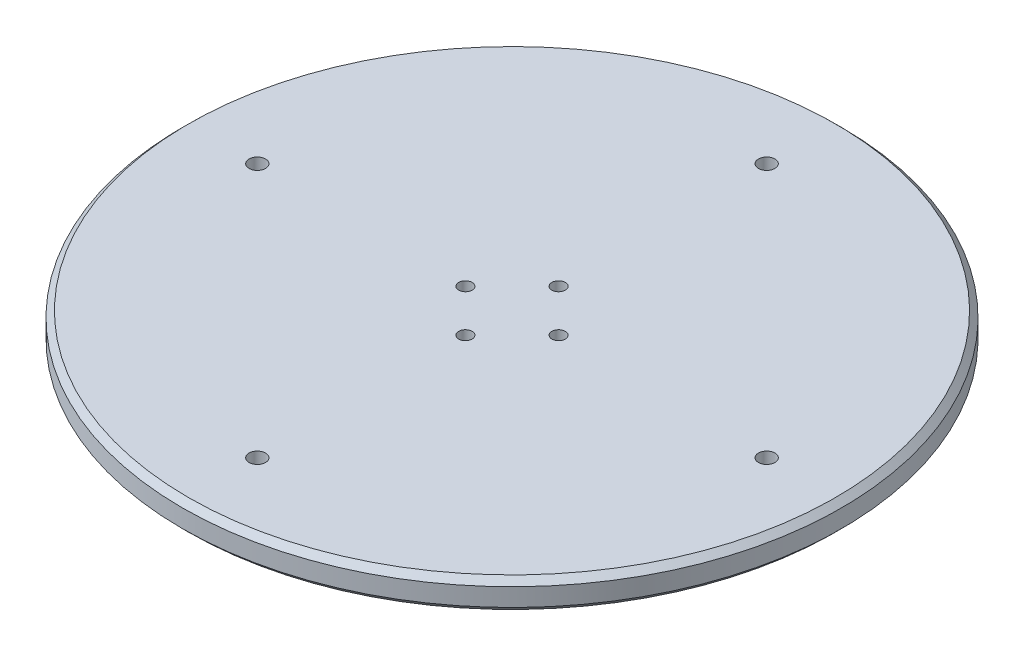
ISO-10303-21;
HEADER;
FILE_DESCRIPTION(('STEP AP214'),'2;1');
FILE_NAME('part.step','',(''),(''),'','','');
FILE_SCHEMA(('AUTOMOTIVE_DESIGN { 1 0 10303 214 1 1 1 1 }'));
ENDSEC;
DATA;
#1=APPLICATION_CONTEXT('core data for automotive mechanical design processes');
#2=APPLICATION_PROTOCOL_DEFINITION('international standard','automotive_design',2000,#1);
#3=PRODUCT_CONTEXT('',#1,'mechanical');
#4=PRODUCT('Part','Part','',(#3));
#5=PRODUCT_RELATED_PRODUCT_CATEGORY('part','',(#4));
#6=PRODUCT_DEFINITION_FORMATION('','',#4);
#7=PRODUCT_DEFINITION_CONTEXT('part definition',#1,'design');
#8=PRODUCT_DEFINITION('design','',#6,#7);
#9=PRODUCT_DEFINITION_SHAPE('','',#8);
#10=(LENGTH_UNIT() NAMED_UNIT(*) SI_UNIT(.MILLI.,.METRE.));
#11=(NAMED_UNIT(*) PLANE_ANGLE_UNIT() SI_UNIT($,.RADIAN.));
#12=(NAMED_UNIT(*) SI_UNIT($,.STERADIAN.) SOLID_ANGLE_UNIT());
#13=UNCERTAINTY_MEASURE_WITH_UNIT(LENGTH_MEASURE(1.E-05),#10,'distance_accuracy_value','');
#14=(GEOMETRIC_REPRESENTATION_CONTEXT(3) GLOBAL_UNCERTAINTY_ASSIGNED_CONTEXT((#13)) GLOBAL_UNIT_ASSIGNED_CONTEXT((#10,
#11,#12)) REPRESENTATION_CONTEXT('',''));
#15=CARTESIAN_POINT('',(0.,0.,0.));
#16=DIRECTION('',(0.,0.,1.));
#17=DIRECTION('',(1.,0.,0.));
#18=AXIS2_PLACEMENT_3D('',#15,#16,#17);
#19=CARTESIAN_POINT('',(0.,10.,0.));
#20=DIRECTION('',(0.,-1.,0.));
#21=DIRECTION('',(0.,0.,-1.));
#22=AXIS2_PLACEMENT_3D('',#19,#20,#21);
#23=CYLINDRICAL_SURFACE('',#22,110.);
#24=CARTESIAN_POINT('',(0.,2.00000000000003,0.));
#25=DIRECTION('',(0.,1.,0.));
#26=DIRECTION('',(0.,0.,1.));
#27=AXIS2_PLACEMENT_3D('',#24,#25,#26);
#28=CIRCLE('',#27,110.);
#29=CARTESIAN_POINT('',(0.,2.00000000000003,110.));
#30=VERTEX_POINT('',#29);
#31=EDGE_CURVE('E51',#30,#30,#28,.T.);
#32=ORIENTED_EDGE('',*,*,#31,.T.);
#33=EDGE_LOOP('',(#32));
#34=FACE_BOUND('',#33,.T.);
#35=CARTESIAN_POINT('',(0.,7.99999999999994,0.));
#36=DIRECTION('',(0.,1.,0.));
#37=DIRECTION('',(0.,0.,1.));
#38=AXIS2_PLACEMENT_3D('',#35,#36,#37);
#39=CIRCLE('',#38,110.);
#40=CARTESIAN_POINT('',(0.,7.99999999999994,110.));
#41=VERTEX_POINT('',#40);
#42=EDGE_CURVE('E55',#41,#41,#39,.F.);
#43=ORIENTED_EDGE('',*,*,#42,.T.);
#44=EDGE_LOOP('',(#43));
#45=FACE_BOUND('',#44,.T.);
#46=ADVANCED_FACE('F39',(#34,#45),#23,.T.);
#47=CARTESIAN_POINT('',(0.,10.,0.));
#48=DIRECTION('',(0.,1.,0.));
#49=DIRECTION('',(0.,0.,1.));
#50=AXIS2_PLACEMENT_3D('',#47,#48,#49);
#51=PLANE('',#50);
#52=CARTESIAN_POINT('',(14.8492424049175,10.,-0.707106781186474));
#53=DIRECTION('',(0.,1.,0.));
#54=DIRECTION('',(0.,0.,1.));
#55=AXIS2_PLACEMENT_3D('',#52,#53,#54);
#56=CIRCLE('',#55,2.25);
#57=CARTESIAN_POINT('',(14.8492424049175,10.,1.54289321881353));
#58=VERTEX_POINT('',#57);
#59=EDGE_CURVE('E103',#58,#58,#56,.T.);
#60=ORIENTED_EDGE('',*,*,#59,.F.);
#61=EDGE_LOOP('',(#60));
#62=FACE_BOUND('',#61,.T.);
#63=CARTESIAN_POINT('',(0.707106781186637,10.,-14.8492424049175));
#64=DIRECTION('',(0.,1.,0.));
#65=DIRECTION('',(0.,0.,-1.));
#66=AXIS2_PLACEMENT_3D('',#63,#64,#65);
#67=CIRCLE('',#66,2.25);
#68=CARTESIAN_POINT('',(0.707106781186637,10.,-17.0992424049175));
#69=VERTEX_POINT('',#68);
#70=EDGE_CURVE('E100',#69,#69,#67,.T.);
#71=ORIENTED_EDGE('',*,*,#70,.F.);
#72=EDGE_LOOP('',(#71));
#73=FACE_BOUND('',#72,.T.);
#74=CARTESIAN_POINT('',(-14.8492424049176,10.,0.707106781186647));
#75=DIRECTION('',(0.,1.,0.));
#76=DIRECTION('',(0.,0.,1.));
#77=AXIS2_PLACEMENT_3D('',#74,#75,#76);
#78=CIRCLE('',#77,2.25);
#79=CARTESIAN_POINT('',(-14.8492424049176,10.,2.95710678118665));
#80=VERTEX_POINT('',#79);
#81=EDGE_CURVE('E94',#80,#80,#78,.T.);
#82=ORIENTED_EDGE('',*,*,#81,.F.);
#83=EDGE_LOOP('',(#82));
#84=FACE_BOUND('',#83,.T.);
#85=CARTESIAN_POINT('',(-0.707106781186627,10.,14.8492424049176));
#86=DIRECTION('',(0.,1.,0.));
#87=DIRECTION('',(0.,0.,-1.));
#88=AXIS2_PLACEMENT_3D('',#85,#86,#87);
#89=CIRCLE('',#88,2.25);
#90=CARTESIAN_POINT('',(-0.707106781186627,10.,12.5992424049176));
#91=VERTEX_POINT('',#90);
#92=EDGE_CURVE('E88',#91,#91,#89,.T.);
#93=ORIENTED_EDGE('',*,*,#92,.F.);
#94=EDGE_LOOP('',(#93));
#95=FACE_BOUND('',#94,.T.);
#96=CARTESIAN_POINT('',(0.,10.,0.));
#97=DIRECTION('',(0.,1.,0.));
#98=DIRECTION('',(0.,0.,1.));
#99=AXIS2_PLACEMENT_3D('',#96,#97,#98);
#100=CIRCLE('',#99,108.);
#101=CARTESIAN_POINT('',(0.,10.,108.));
#102=VERTEX_POINT('',#101);
#103=EDGE_CURVE('E10',#102,#102,#100,.T.);
#104=ORIENTED_EDGE('',*,*,#103,.T.);
#105=EDGE_LOOP('',(#104));
#106=FACE_BOUND('',#105,.T.);
#107=CARTESIAN_POINT('',(-85.,10.,0.));
#108=DIRECTION('',(0.,1.,0.));
#109=DIRECTION('',(0.,0.,1.));
#110=AXIS2_PLACEMENT_3D('',#107,#108,#109);
#111=CIRCLE('',#110,2.75000000000001);
#112=CARTESIAN_POINT('',(-85.,10.,2.75000000000001));
#113=VERTEX_POINT('',#112);
#114=EDGE_CURVE('E80',#113,#113,#111,.T.);
#115=ORIENTED_EDGE('',*,*,#114,.F.);
#116=EDGE_LOOP('',(#115));
#117=FACE_BOUND('',#116,.T.);
#118=CARTESIAN_POINT('',(2.96775913801666E-13,10.,-85.));
#119=DIRECTION('',(0.,1.,0.));
#120=DIRECTION('',(0.,0.,1.));
#121=AXIS2_PLACEMENT_3D('',#118,#119,#120);
#122=CIRCLE('',#121,2.75000000000001);
#123=CARTESIAN_POINT('',(2.96775913801666E-13,10.,-82.25));
#124=VERTEX_POINT('',#123);
#125=EDGE_CURVE('E77',#124,#124,#122,.T.);
#126=ORIENTED_EDGE('',*,*,#125,.F.);
#127=EDGE_LOOP('',(#126));
#128=FACE_BOUND('',#127,.T.);
#129=CARTESIAN_POINT('',(85.,10.,5.93551827603333E-13));
#130=DIRECTION('',(0.,1.,0.));
#131=DIRECTION('',(0.,0.,1.));
#132=AXIS2_PLACEMENT_3D('',#129,#130,#131);
#133=CIRCLE('',#132,2.75);
#134=CARTESIAN_POINT('',(85.,10.,2.7500000000006));
#135=VERTEX_POINT('',#134);
#136=EDGE_CURVE('E71',#135,#135,#133,.T.);
#137=ORIENTED_EDGE('',*,*,#136,.F.);
#138=EDGE_LOOP('',(#137));
#139=FACE_BOUND('',#138,.T.);
#140=CARTESIAN_POINT('',(-8.90327741404999E-13,10.,85.));
#141=DIRECTION('',(0.,1.,0.));
#142=DIRECTION('',(0.,0.,1.));
#143=AXIS2_PLACEMENT_3D('',#140,#141,#142);
#144=CIRCLE('',#143,2.75000000000001);
#145=CARTESIAN_POINT('',(-8.90327741404999E-13,10.,87.75));
#146=VERTEX_POINT('',#145);
#147=EDGE_CURVE('E64',#146,#146,#144,.T.);
#148=ORIENTED_EDGE('',*,*,#147,.F.);
#149=EDGE_LOOP('',(#148));
#150=FACE_BOUND('',#149,.T.);
#151=ADVANCED_FACE('F119',(#62,#73,#84,#95,#106,#117,#128,#139,#150),#51,.T.);
#152=CARTESIAN_POINT('',(0.,0.,0.));
#153=DIRECTION('',(0.,1.,0.));
#154=DIRECTION('',(0.,0.,1.));
#155=AXIS2_PLACEMENT_3D('',#152,#153,#154);
#156=PLANE('',#155);
#157=CARTESIAN_POINT('',(14.8492424049175,0.,-0.707106781186474));
#158=DIRECTION('',(0.,1.,0.));
#159=DIRECTION('',(0.,0.,1.));
#160=AXIS2_PLACEMENT_3D('',#157,#158,#159);
#161=CIRCLE('',#160,2.25);
#162=CARTESIAN_POINT('',(14.8492424049175,0.,1.54289321881353));
#163=VERTEX_POINT('',#162);
#164=EDGE_CURVE('E65',#163,#163,#161,.T.);
#165=ORIENTED_EDGE('',*,*,#164,.T.);
#166=EDGE_LOOP('',(#165));
#167=FACE_BOUND('',#166,.T.);
#168=CARTESIAN_POINT('',(0.707106781186637,0.,-14.8492424049175));
#169=DIRECTION('',(0.,1.,0.));
#170=DIRECTION('',(0.,0.,-1.));
#171=AXIS2_PLACEMENT_3D('',#168,#169,#170);
#172=CIRCLE('',#171,2.25);
#173=CARTESIAN_POINT('',(0.707106781186637,0.,-17.0992424049175));
#174=VERTEX_POINT('',#173);
#175=EDGE_CURVE('E97',#174,#174,#172,.T.);
#176=ORIENTED_EDGE('',*,*,#175,.T.);
#177=EDGE_LOOP('',(#176));
#178=FACE_BOUND('',#177,.T.);
#179=CARTESIAN_POINT('',(-14.8492424049176,0.,0.707106781186647));
#180=DIRECTION('',(0.,1.,0.));
#181=DIRECTION('',(0.,0.,1.));
#182=AXIS2_PLACEMENT_3D('',#179,#180,#181);
#183=CIRCLE('',#182,2.25);
#184=CARTESIAN_POINT('',(-14.8492424049176,0.,2.95710678118665));
#185=VERTEX_POINT('',#184);
#186=EDGE_CURVE('E91',#185,#185,#183,.T.);
#187=ORIENTED_EDGE('',*,*,#186,.T.);
#188=EDGE_LOOP('',(#187));
#189=FACE_BOUND('',#188,.T.);
#190=CARTESIAN_POINT('',(-0.707106781186627,0.,14.8492424049176));
#191=DIRECTION('',(0.,1.,0.));
#192=DIRECTION('',(0.,0.,-1.));
#193=AXIS2_PLACEMENT_3D('',#190,#191,#192);
#194=CIRCLE('',#193,2.25);
#195=CARTESIAN_POINT('',(-0.707106781186627,0.,12.5992424049176));
#196=VERTEX_POINT('',#195);
#197=EDGE_CURVE('E85',#196,#196,#194,.T.);
#198=ORIENTED_EDGE('',*,*,#197,.T.);
#199=EDGE_LOOP('',(#198));
#200=FACE_BOUND('',#199,.T.);
#201=CARTESIAN_POINT('',(0.,0.,0.));
#202=DIRECTION('',(0.,1.,0.));
#203=DIRECTION('',(0.,0.,1.));
#204=AXIS2_PLACEMENT_3D('',#201,#202,#203);
#205=CIRCLE('',#204,108.);
#206=CARTESIAN_POINT('',(0.,0.,108.));
#207=VERTEX_POINT('',#206);
#208=EDGE_CURVE('E47',#207,#207,#205,.F.);
#209=ORIENTED_EDGE('',*,*,#208,.T.);
#210=EDGE_LOOP('',(#209));
#211=FACE_BOUND('',#210,.T.);
#212=CARTESIAN_POINT('',(-85.,0.,0.));
#213=DIRECTION('',(0.,1.,0.));
#214=DIRECTION('',(0.,0.,1.));
#215=AXIS2_PLACEMENT_3D('',#212,#213,#214);
#216=CIRCLE('',#215,2.75000000000001);
#217=CARTESIAN_POINT('',(-85.,0.,2.75000000000001));
#218=VERTEX_POINT('',#217);
#219=EDGE_CURVE('E60',#218,#218,#216,.T.);
#220=ORIENTED_EDGE('',*,*,#219,.T.);
#221=EDGE_LOOP('',(#220));
#222=FACE_BOUND('',#221,.T.);
#223=CARTESIAN_POINT('',(2.96775913801666E-13,0.,-85.));
#224=DIRECTION('',(0.,1.,0.));
#225=DIRECTION('',(0.,0.,1.));
#226=AXIS2_PLACEMENT_3D('',#223,#224,#225);
#227=CIRCLE('',#226,2.75000000000001);
#228=CARTESIAN_POINT('',(2.96775913801666E-13,0.,-82.25));
#229=VERTEX_POINT('',#228);
#230=EDGE_CURVE('E74',#229,#229,#227,.T.);
#231=ORIENTED_EDGE('',*,*,#230,.T.);
#232=EDGE_LOOP('',(#231));
#233=FACE_BOUND('',#232,.T.);
#234=CARTESIAN_POINT('',(85.,0.,5.93551827603333E-13));
#235=DIRECTION('',(0.,1.,0.));
#236=DIRECTION('',(0.,0.,1.));
#237=AXIS2_PLACEMENT_3D('',#234,#235,#236);
#238=CIRCLE('',#237,2.75);
#239=CARTESIAN_POINT('',(85.,0.,2.7500000000006));
#240=VERTEX_POINT('',#239);
#241=EDGE_CURVE('E68',#240,#240,#238,.T.);
#242=ORIENTED_EDGE('',*,*,#241,.T.);
#243=EDGE_LOOP('',(#242));
#244=FACE_BOUND('',#243,.T.);
#245=CARTESIAN_POINT('',(-8.90327741404999E-13,0.,85.));
#246=DIRECTION('',(0.,1.,0.));
#247=DIRECTION('',(0.,0.,1.));
#248=AXIS2_PLACEMENT_3D('',#245,#246,#247);
#249=CIRCLE('',#248,2.75000000000001);
#250=CARTESIAN_POINT('',(-8.90327741404999E-13,0.,87.75));
#251=VERTEX_POINT('',#250);
#252=EDGE_CURVE('E61',#251,#251,#249,.T.);
#253=ORIENTED_EDGE('',*,*,#252,.T.);
#254=EDGE_LOOP('',(#253));
#255=FACE_BOUND('',#254,.T.);
#256=ADVANCED_FACE('F109',(#167,#178,#189,#200,#211,#222,#233,#244,#255),#156,.F.);
#257=CARTESIAN_POINT('',(-8.90327741404999E-13,0.,85.));
#258=DIRECTION('',(0.,1.,0.));
#259=DIRECTION('',(0.,0.,1.));
#260=AXIS2_PLACEMENT_3D('',#257,#258,#259);
#261=CYLINDRICAL_SURFACE('',#260,2.75000000000001);
#262=ORIENTED_EDGE('',*,*,#252,.F.);
#263=EDGE_LOOP('',(#262));
#264=FACE_BOUND('',#263,.T.);
#265=ORIENTED_EDGE('',*,*,#147,.T.);
#266=EDGE_LOOP('',(#265));
#267=FACE_BOUND('',#266,.T.);
#268=ADVANCED_FACE('F137',(#264,#267),#261,.F.);
#269=CARTESIAN_POINT('',(85.,0.,5.93551827603333E-13));
#270=DIRECTION('',(0.,1.,0.));
#271=DIRECTION('',(0.,0.,1.));
#272=AXIS2_PLACEMENT_3D('',#269,#270,#271);
#273=CYLINDRICAL_SURFACE('',#272,2.75);
#274=ORIENTED_EDGE('',*,*,#241,.F.);
#275=EDGE_LOOP('',(#274));
#276=FACE_BOUND('',#275,.T.);
#277=ORIENTED_EDGE('',*,*,#136,.T.);
#278=EDGE_LOOP('',(#277));
#279=FACE_BOUND('',#278,.T.);
#280=ADVANCED_FACE('F139',(#276,#279),#273,.F.);
#281=CARTESIAN_POINT('',(2.96775913801666E-13,0.,-85.));
#282=DIRECTION('',(0.,1.,0.));
#283=DIRECTION('',(0.,0.,1.));
#284=AXIS2_PLACEMENT_3D('',#281,#282,#283);
#285=CYLINDRICAL_SURFACE('',#284,2.75000000000001);
#286=ORIENTED_EDGE('',*,*,#230,.F.);
#287=EDGE_LOOP('',(#286));
#288=FACE_BOUND('',#287,.T.);
#289=ORIENTED_EDGE('',*,*,#125,.T.);
#290=EDGE_LOOP('',(#289));
#291=FACE_BOUND('',#290,.T.);
#292=ADVANCED_FACE('F145',(#288,#291),#285,.F.);
#293=CARTESIAN_POINT('',(-85.,0.,0.));
#294=DIRECTION('',(0.,1.,0.));
#295=DIRECTION('',(0.,0.,1.));
#296=AXIS2_PLACEMENT_3D('',#293,#294,#295);
#297=CYLINDRICAL_SURFACE('',#296,2.75000000000001);
#298=ORIENTED_EDGE('',*,*,#219,.F.);
#299=EDGE_LOOP('',(#298));
#300=FACE_BOUND('',#299,.T.);
#301=ORIENTED_EDGE('',*,*,#114,.T.);
#302=EDGE_LOOP('',(#301));
#303=FACE_BOUND('',#302,.T.);
#304=ADVANCED_FACE('F163',(#300,#303),#297,.F.);
#305=CARTESIAN_POINT('',(0.,2.00000000000003,0.));
#306=DIRECTION('',(0.,1.,0.));
#307=DIRECTION('',(0.,0.,1.));
#308=AXIS2_PLACEMENT_3D('',#305,#306,#307);
#309=CONICAL_SURFACE('',#308,110.,0.785398163397445);
#310=ORIENTED_EDGE('',*,*,#208,.F.);
#311=EDGE_LOOP('',(#310));
#312=FACE_BOUND('',#311,.T.);
#313=ORIENTED_EDGE('',*,*,#31,.F.);
#314=EDGE_LOOP('',(#313));
#315=FACE_BOUND('',#314,.T.);
#316=ADVANCED_FACE('F160',(#312,#315),#309,.T.);
#317=CARTESIAN_POINT('',(0.,10.,0.));
#318=DIRECTION('',(0.,-1.,0.));
#319=DIRECTION('',(0.,0.,-1.));
#320=AXIS2_PLACEMENT_3D('',#317,#318,#319);
#321=CONICAL_SURFACE('',#320,108.,0.785398163397448);
#322=ORIENTED_EDGE('',*,*,#42,.F.);
#323=EDGE_LOOP('',(#322));
#324=FACE_BOUND('',#323,.T.);
#325=ORIENTED_EDGE('',*,*,#103,.F.);
#326=EDGE_LOOP('',(#325));
#327=FACE_BOUND('',#326,.T.);
#328=ADVANCED_FACE('F42',(#324,#327),#321,.T.);
#329=CARTESIAN_POINT('',(-0.707106781186627,0.,14.8492424049176));
#330=DIRECTION('',(0.,1.,0.));
#331=DIRECTION('',(0.,0.,1.));
#332=AXIS2_PLACEMENT_3D('',#329,#330,#331);
#333=CYLINDRICAL_SURFACE('',#332,2.25);
#334=ORIENTED_EDGE('',*,*,#197,.F.);
#335=EDGE_LOOP('',(#334));
#336=FACE_BOUND('',#335,.T.);
#337=ORIENTED_EDGE('',*,*,#92,.T.);
#338=EDGE_LOOP('',(#337));
#339=FACE_BOUND('',#338,.T.);
#340=ADVANCED_FACE('F168',(#336,#339),#333,.F.);
#341=CARTESIAN_POINT('',(-14.8492424049176,0.,0.707106781186647));
#342=DIRECTION('',(0.,1.,0.));
#343=DIRECTION('',(0.,0.,1.));
#344=AXIS2_PLACEMENT_3D('',#341,#342,#343);
#345=CYLINDRICAL_SURFACE('',#344,2.25);
#346=ORIENTED_EDGE('',*,*,#186,.F.);
#347=EDGE_LOOP('',(#346));
#348=FACE_BOUND('',#347,.T.);
#349=ORIENTED_EDGE('',*,*,#81,.T.);
#350=EDGE_LOOP('',(#349));
#351=FACE_BOUND('',#350,.T.);
#352=ADVANCED_FACE('F184',(#348,#351),#345,.F.);
#353=CARTESIAN_POINT('',(0.707106781186637,0.,-14.8492424049175));
#354=DIRECTION('',(0.,1.,0.));
#355=DIRECTION('',(0.,0.,1.));
#356=AXIS2_PLACEMENT_3D('',#353,#354,#355);
#357=CYLINDRICAL_SURFACE('',#356,2.25);
#358=ORIENTED_EDGE('',*,*,#175,.F.);
#359=EDGE_LOOP('',(#358));
#360=FACE_BOUND('',#359,.T.);
#361=ORIENTED_EDGE('',*,*,#70,.T.);
#362=EDGE_LOOP('',(#361));
#363=FACE_BOUND('',#362,.T.);
#364=ADVANCED_FACE('F115',(#360,#363),#357,.F.);
#365=CARTESIAN_POINT('',(14.8492424049175,0.,-0.707106781186474));
#366=DIRECTION('',(0.,1.,0.));
#367=DIRECTION('',(0.,0.,1.));
#368=AXIS2_PLACEMENT_3D('',#365,#366,#367);
#369=CYLINDRICAL_SURFACE('',#368,2.25);
#370=ORIENTED_EDGE('',*,*,#164,.F.);
#371=EDGE_LOOP('',(#370));
#372=FACE_BOUND('',#371,.T.);
#373=ORIENTED_EDGE('',*,*,#59,.T.);
#374=EDGE_LOOP('',(#373));
#375=FACE_BOUND('',#374,.T.);
#376=ADVANCED_FACE('F112',(#372,#375),#369,.F.);
#377=CLOSED_SHELL('',(#46,#151,#256,#268,#280,#292,#304,#316,#328,#340,#352,#364,#376));
#378=MANIFOLD_SOLID_BREP('B2',#377);
#379=ADVANCED_BREP_SHAPE_REPRESENTATION('',(#18,#378),#14);
#380=SHAPE_DEFINITION_REPRESENTATION(#9,#379);
ENDSEC;
END-ISO-10303-21;
